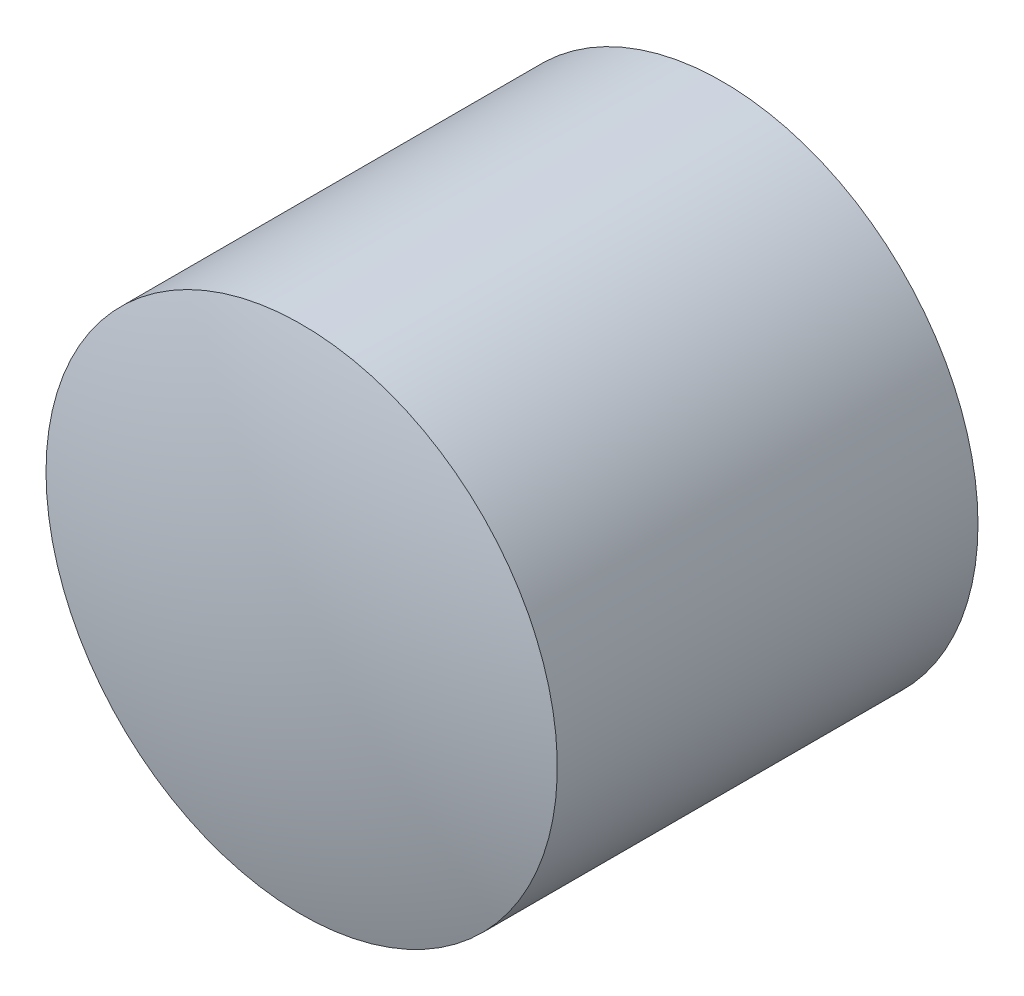
ISO-10303-21;
HEADER;
FILE_DESCRIPTION(('STEP AP214'),'2;1');
FILE_NAME('part.step','',(''),(''),'','','');
FILE_SCHEMA(('AUTOMOTIVE_DESIGN { 1 0 10303 214 1 1 1 1 }'));
ENDSEC;
DATA;
#1=APPLICATION_CONTEXT('core data for automotive mechanical design processes');
#2=APPLICATION_PROTOCOL_DEFINITION('international standard','automotive_design',2000,#1);
#3=PRODUCT_CONTEXT('',#1,'mechanical');
#4=PRODUCT('Part','Part','',(#3));
#5=PRODUCT_RELATED_PRODUCT_CATEGORY('part','',(#4));
#6=PRODUCT_DEFINITION_FORMATION('','',#4);
#7=PRODUCT_DEFINITION_CONTEXT('part definition',#1,'design');
#8=PRODUCT_DEFINITION('design','',#6,#7);
#9=PRODUCT_DEFINITION_SHAPE('','',#8);
#10=(LENGTH_UNIT() NAMED_UNIT(*) SI_UNIT(.MILLI.,.METRE.));
#11=(NAMED_UNIT(*) PLANE_ANGLE_UNIT() SI_UNIT($,.RADIAN.));
#12=(NAMED_UNIT(*) SI_UNIT($,.STERADIAN.) SOLID_ANGLE_UNIT());
#13=UNCERTAINTY_MEASURE_WITH_UNIT(LENGTH_MEASURE(1.E-05),#10,'distance_accuracy_value','');
#14=(GEOMETRIC_REPRESENTATION_CONTEXT(3) GLOBAL_UNCERTAINTY_ASSIGNED_CONTEXT((#13)) GLOBAL_UNIT_ASSIGNED_CONTEXT((#10,
#11,#12)) REPRESENTATION_CONTEXT('',''));
#15=CARTESIAN_POINT('',(0.,0.,0.));
#16=DIRECTION('',(0.,0.,1.));
#17=DIRECTION('',(1.,0.,0.));
#18=AXIS2_PLACEMENT_3D('',#15,#16,#17);
#19=CARTESIAN_POINT('',(0.,0.,-3.675823272123));
#20=DIRECTION('',(0.,-1.,0.));
#21=DIRECTION('',(-1.,0.,0.));
#22=AXIS2_PLACEMENT_3D('',#19,#20,#21);
#23=SPHERICAL_SURFACE('',#22,5.);
#24=CARTESIAN_POINT('',(0.,0.,-3.675823272123));
#25=DIRECTION('',(0.,0.,-1.));
#26=DIRECTION('',(-1.,0.,0.));
#27=AXIS2_PLACEMENT_3D('',#24,#25,#26);
#28=SPHERICAL_SURFACE('',#27,5.);
#29=CARTESIAN_POINT('',(0.,0.,1.13139785863435));
#30=DIRECTION('',(0.,0.,-1.));
#31=DIRECTION('',(-1.,0.,0.));
#32=AXIS2_PLACEMENT_3D('',#29,#30,#31);
#33=CIRCLE('',#32,1.375);
#34=CARTESIAN_POINT('',(-1.375,0.,1.13139785863435));
#35=VERTEX_POINT('',#34);
#36=EDGE_CURVE('E46',#35,#35,#33,.F.);
#37=ORIENTED_EDGE('',*,*,#36,.T.);
#38=EDGE_LOOP('',(#37));
#39=FACE_BOUND('',#38,.T.);
#40=ADVANCED_FACE('F43',(#39),#28,.T.);
#41=CARTESIAN_POINT('',(0.,0.,3.824176727877));
#42=DIRECTION('',(0.,0.,-1.));
#43=DIRECTION('',(-1.,0.,0.));
#44=AXIS2_PLACEMENT_3D('',#41,#42,#43);
#45=CYLINDRICAL_SURFACE('',#44,1.375);
#46=CARTESIAN_POINT('',(0.,0.,-1.13139785863435));
#47=DIRECTION('',(0.,0.,1.));
#48=DIRECTION('',(1.,0.,0.));
#49=AXIS2_PLACEMENT_3D('',#46,#47,#48);
#50=CIRCLE('',#49,1.375);
#51=CARTESIAN_POINT('',(1.375,0.,-1.13139785863435));
#52=VERTEX_POINT('',#51);
#53=EDGE_CURVE('E10',#52,#52,#50,.F.);
#54=ORIENTED_EDGE('',*,*,#53,.F.);
#55=EDGE_LOOP('',(#54));
#56=FACE_BOUND('',#55,.T.);
#57=ORIENTED_EDGE('',*,*,#36,.F.);
#58=EDGE_LOOP('',(#57));
#59=FACE_BOUND('',#58,.T.);
#60=ADVANCED_FACE('F58',(#56,#59),#45,.T.);
#61=CARTESIAN_POINT('',(0.,0.,3.675823272123));
#62=DIRECTION('',(0.,-1.,0.));
#63=DIRECTION('',(-1.,0.,0.));
#64=AXIS2_PLACEMENT_3D('',#61,#62,#63);
#65=SPHERICAL_SURFACE('',#64,5.);
#66=CARTESIAN_POINT('',(0.,0.,3.675823272123));
#67=DIRECTION('',(0.,0.,1.));
#68=DIRECTION('',(1.,0.,0.));
#69=AXIS2_PLACEMENT_3D('',#66,#67,#68);
#70=SPHERICAL_SURFACE('',#69,5.);
#71=ORIENTED_EDGE('',*,*,#53,.T.);
#72=EDGE_LOOP('',(#71));
#73=FACE_BOUND('',#72,.T.);
#74=ADVANCED_FACE('F60',(#73),#70,.T.);
#75=CLOSED_SHELL('',(#40,#60,#74));
#76=MANIFOLD_SOLID_BREP('B2',#75);
#77=ADVANCED_BREP_SHAPE_REPRESENTATION('',(#18,#76),#14);
#78=SHAPE_DEFINITION_REPRESENTATION(#9,#77);
ENDSEC;
END-ISO-10303-21;
